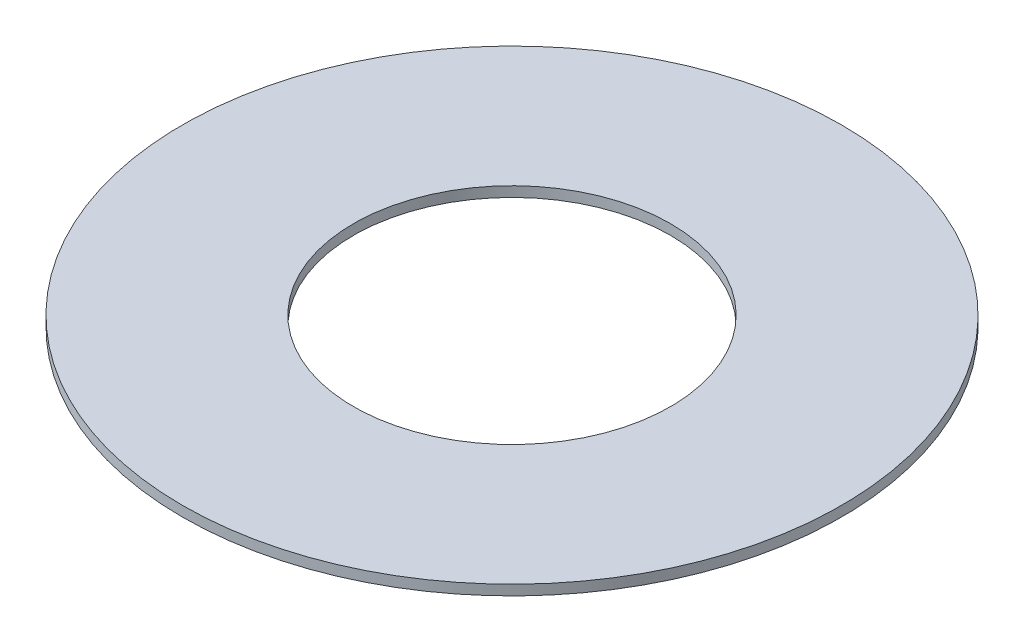
ISO-10303-21;
HEADER;
FILE_DESCRIPTION(('STEP AP214'),'2;1');
FILE_NAME('part.step','',(''),(''),'','','');
FILE_SCHEMA(('AUTOMOTIVE_DESIGN { 1 0 10303 214 1 1 1 1 }'));
ENDSEC;
DATA;
#1=APPLICATION_CONTEXT('core data for automotive mechanical design processes');
#2=APPLICATION_PROTOCOL_DEFINITION('international standard','automotive_design',2000,#1);
#3=PRODUCT_CONTEXT('',#1,'mechanical');
#4=PRODUCT('Part','Part','',(#3));
#5=PRODUCT_RELATED_PRODUCT_CATEGORY('part','',(#4));
#6=PRODUCT_DEFINITION_FORMATION('','',#4);
#7=PRODUCT_DEFINITION_CONTEXT('part definition',#1,'design');
#8=PRODUCT_DEFINITION('design','',#6,#7);
#9=PRODUCT_DEFINITION_SHAPE('','',#8);
#10=(LENGTH_UNIT() NAMED_UNIT(*) SI_UNIT(.MILLI.,.METRE.));
#11=(NAMED_UNIT(*) PLANE_ANGLE_UNIT() SI_UNIT($,.RADIAN.));
#12=(NAMED_UNIT(*) SI_UNIT($,.STERADIAN.) SOLID_ANGLE_UNIT());
#13=UNCERTAINTY_MEASURE_WITH_UNIT(LENGTH_MEASURE(1.E-05),#10,'distance_accuracy_value','');
#14=(GEOMETRIC_REPRESENTATION_CONTEXT(3) GLOBAL_UNCERTAINTY_ASSIGNED_CONTEXT((#13)) GLOBAL_UNIT_ASSIGNED_CONTEXT((#10,
#11,#12)) REPRESENTATION_CONTEXT('',''));
#15=CARTESIAN_POINT('',(0.,0.,0.));
#16=DIRECTION('',(0.,0.,1.));
#17=DIRECTION('',(1.,0.,0.));
#18=AXIS2_PLACEMENT_3D('',#15,#16,#17);
#19=CARTESIAN_POINT('',(-327.57063907764,-11.3178416921494,0.));
#20=DIRECTION('',(0.,-1.,0.));
#21=DIRECTION('',(0.,0.,-1.));
#22=AXIS2_PLACEMENT_3D('',#19,#20,#21);
#23=CYLINDRICAL_SURFACE('',#22,865.357510864341);
#24=CARTESIAN_POINT('',(-327.57063907764,-11.3178416921494,0.));
#25=DIRECTION('',(0.,-1.,0.));
#26=DIRECTION('',(0.,0.,-1.));
#27=AXIS2_PLACEMENT_3D('',#24,#25,#26);
#28=CIRCLE('',#27,865.357510864341);
#29=CARTESIAN_POINT('',(-327.57063907764,-11.3178416921494,-865.357510864341));
#30=VERTEX_POINT('',#29);
#31=EDGE_CURVE('E10',#30,#30,#28,.T.);
#32=ORIENTED_EDGE('',*,*,#31,.T.);
#33=EDGE_LOOP('',(#32));
#34=FACE_BOUND('',#33,.T.);
#35=CARTESIAN_POINT('',(-327.57063907764,44.1760917661317,0.));
#36=DIRECTION('',(0.,-1.,0.));
#37=DIRECTION('',(0.,0.,-1.));
#38=AXIS2_PLACEMENT_3D('',#35,#36,#37);
#39=CIRCLE('',#38,865.357510864341);
#40=CARTESIAN_POINT('',(-327.57063907764,44.1760917661317,-865.357510864341));
#41=VERTEX_POINT('',#40);
#42=EDGE_CURVE('E52',#41,#41,#39,.T.);
#43=ORIENTED_EDGE('',*,*,#42,.F.);
#44=EDGE_LOOP('',(#43));
#45=FACE_BOUND('',#44,.T.);
#46=ADVANCED_FACE('F38',(#34,#45),#23,.F.);
#47=CARTESIAN_POINT('',(537.786871786701,-11.3178416921494,0.));
#48=DIRECTION('',(0.,-1.,0.));
#49=DIRECTION('',(0.,0.,-1.));
#50=AXIS2_PLACEMENT_3D('',#47,#48,#49);
#51=PLANE('',#50);
#52=CARTESIAN_POINT('',(-327.57063907764,-11.3178416921494,0.));
#53=DIRECTION('',(0.,-1.,0.));
#54=DIRECTION('',(0.,0.,-1.));
#55=AXIS2_PLACEMENT_3D('',#52,#53,#54);
#56=CIRCLE('',#55,1799.01860185542);
#57=CARTESIAN_POINT('',(-327.57063907764,-11.3178416921494,-1799.01860185542));
#58=VERTEX_POINT('',#57);
#59=EDGE_CURVE('E44',#58,#58,#56,.T.);
#60=ORIENTED_EDGE('',*,*,#59,.T.);
#61=EDGE_LOOP('',(#60));
#62=FACE_BOUND('',#61,.T.);
#63=ORIENTED_EDGE('',*,*,#31,.F.);
#64=EDGE_LOOP('',(#63));
#65=FACE_BOUND('',#64,.T.);
#66=ADVANCED_FACE('F62',(#62,#65),#51,.T.);
#67=CARTESIAN_POINT('',(-327.57063907764,-11.3178416921494,0.));
#68=DIRECTION('',(0.,-1.,0.));
#69=DIRECTION('',(0.,0.,-1.));
#70=AXIS2_PLACEMENT_3D('',#67,#68,#69);
#71=CYLINDRICAL_SURFACE('',#70,1799.01860185542);
#72=CARTESIAN_POINT('',(-327.57063907764,44.1760917661317,0.));
#73=DIRECTION('',(0.,-1.,0.));
#74=DIRECTION('',(0.,0.,-1.));
#75=AXIS2_PLACEMENT_3D('',#72,#73,#74);
#76=CIRCLE('',#75,1799.01860185542);
#77=CARTESIAN_POINT('',(-327.57063907764,44.1760917661317,-1799.01860185542));
#78=VERTEX_POINT('',#77);
#79=EDGE_CURVE('E48',#78,#78,#76,.T.);
#80=ORIENTED_EDGE('',*,*,#79,.T.);
#81=EDGE_LOOP('',(#80));
#82=FACE_BOUND('',#81,.T.);
#83=ORIENTED_EDGE('',*,*,#59,.F.);
#84=EDGE_LOOP('',(#83));
#85=FACE_BOUND('',#84,.T.);
#86=ADVANCED_FACE('F66',(#82,#85),#71,.T.);
#87=CARTESIAN_POINT('',(537.786871786701,44.1760917661317,0.));
#88=DIRECTION('',(0.,1.,0.));
#89=DIRECTION('',(0.,0.,1.));
#90=AXIS2_PLACEMENT_3D('',#87,#88,#89);
#91=PLANE('',#90);
#92=ORIENTED_EDGE('',*,*,#42,.T.);
#93=EDGE_LOOP('',(#92));
#94=FACE_BOUND('',#93,.T.);
#95=ORIENTED_EDGE('',*,*,#79,.F.);
#96=EDGE_LOOP('',(#95));
#97=FACE_BOUND('',#96,.T.);
#98=ADVANCED_FACE('F58',(#94,#97),#91,.T.);
#99=CLOSED_SHELL('',(#46,#66,#86,#98));
#100=MANIFOLD_SOLID_BREP('B2',#99);
#101=ADVANCED_BREP_SHAPE_REPRESENTATION('',(#18,#100),#14);
#102=SHAPE_DEFINITION_REPRESENTATION(#9,#101);
ENDSEC;
END-ISO-10303-21;
